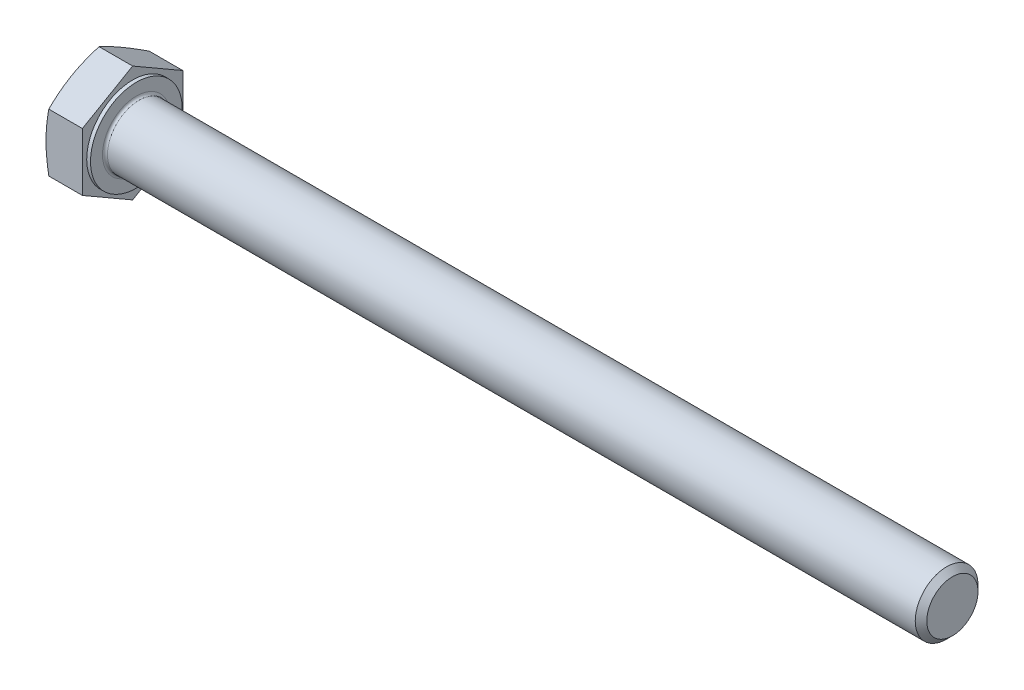
ISO-10303-21;
HEADER;
FILE_DESCRIPTION(('STEP AP214'),'2;1');
FILE_NAME('part.step','',(''),(''),'','','');
FILE_SCHEMA(('AUTOMOTIVE_DESIGN { 1 0 10303 214 1 1 1 1 }'));
ENDSEC;
DATA;
#1=APPLICATION_CONTEXT('core data for automotive mechanical design processes');
#2=APPLICATION_PROTOCOL_DEFINITION('international standard','automotive_design',2000,#1);
#3=PRODUCT_CONTEXT('',#1,'mechanical');
#4=PRODUCT('Part','Part','',(#3));
#5=PRODUCT_RELATED_PRODUCT_CATEGORY('part','',(#4));
#6=PRODUCT_DEFINITION_FORMATION('','',#4);
#7=PRODUCT_DEFINITION_CONTEXT('part definition',#1,'design');
#8=PRODUCT_DEFINITION('design','',#6,#7);
#9=PRODUCT_DEFINITION_SHAPE('','',#8);
#10=(LENGTH_UNIT() NAMED_UNIT(*) SI_UNIT(.MILLI.,.METRE.));
#11=(NAMED_UNIT(*) PLANE_ANGLE_UNIT() SI_UNIT($,.RADIAN.));
#12=(NAMED_UNIT(*) SI_UNIT($,.STERADIAN.) SOLID_ANGLE_UNIT());
#13=UNCERTAINTY_MEASURE_WITH_UNIT(LENGTH_MEASURE(1.E-05),#10,'distance_accuracy_value','');
#14=(GEOMETRIC_REPRESENTATION_CONTEXT(3) GLOBAL_UNCERTAINTY_ASSIGNED_CONTEXT((#13)) GLOBAL_UNIT_ASSIGNED_CONTEXT((#10,
#11,#12)) REPRESENTATION_CONTEXT('',''));
#15=CARTESIAN_POINT('',(0.,0.,0.));
#16=DIRECTION('',(0.,0.,1.));
#17=DIRECTION('',(1.,0.,0.));
#18=AXIS2_PLACEMENT_3D('',#15,#16,#17);
#19=CARTESIAN_POINT('',(-6.40000000000001,4.,0.));
#20=DIRECTION('',(-1.,0.,0.));
#21=DIRECTION('',(0.,-1.,0.));
#22=AXIS2_PLACEMENT_3D('',#19,#20,#21);
#23=PLANE('',#22);
#24=CARTESIAN_POINT('',(-6.4,0.,0.));
#25=DIRECTION('',(1.,0.,0.));
#26=DIRECTION('',(0.,0.,-1.));
#27=AXIS2_PLACEMENT_3D('',#24,#25,#26);
#28=CIRCLE('',#27,8.);
#29=CARTESIAN_POINT('',(-6.4,0.,8.));
#30=VERTEX_POINT('',#29);
#31=CARTESIAN_POINT('',(-6.4,-6.92820323027551,4.));
#32=VERTEX_POINT('',#31);
#33=EDGE_CURVE('E91',#30,#32,#28,.T.);
#34=ORIENTED_EDGE('',*,*,#33,.F.);
#35=CARTESIAN_POINT('',(-6.4,0.,0.));
#36=DIRECTION('',(1.,0.,0.));
#37=DIRECTION('',(0.,0.,-1.));
#38=AXIS2_PLACEMENT_3D('',#35,#36,#37);
#39=CIRCLE('',#38,8.);
#40=CARTESIAN_POINT('',(-6.4,6.92820323027551,4.));
#41=VERTEX_POINT('',#40);
#42=EDGE_CURVE('E88',#41,#30,#39,.T.);
#43=ORIENTED_EDGE('',*,*,#42,.F.);
#44=CARTESIAN_POINT('',(-6.4,0.,0.));
#45=DIRECTION('',(1.,0.,0.));
#46=DIRECTION('',(0.,0.,-1.));
#47=AXIS2_PLACEMENT_3D('',#44,#45,#46);
#48=CIRCLE('',#47,8.);
#49=CARTESIAN_POINT('',(-6.4,6.92820323027551,-4.));
#50=VERTEX_POINT('',#49);
#51=EDGE_CURVE('E20',#50,#41,#48,.T.);
#52=ORIENTED_EDGE('',*,*,#51,.F.);
#53=CARTESIAN_POINT('',(-6.4,0.,0.));
#54=DIRECTION('',(1.,0.,0.));
#55=DIRECTION('',(0.,0.,-1.));
#56=AXIS2_PLACEMENT_3D('',#53,#54,#55);
#57=CIRCLE('',#56,8.);
#58=CARTESIAN_POINT('',(-6.4,0.,-8.));
#59=VERTEX_POINT('',#58);
#60=EDGE_CURVE('E458',#59,#50,#57,.T.);
#61=ORIENTED_EDGE('',*,*,#60,.F.);
#62=CARTESIAN_POINT('',(-6.4,0.,0.));
#63=DIRECTION('',(1.,0.,0.));
#64=DIRECTION('',(0.,0.,-1.));
#65=AXIS2_PLACEMENT_3D('',#62,#63,#64);
#66=CIRCLE('',#65,8.);
#67=CARTESIAN_POINT('',(-6.4,-6.92820323027551,-4.));
#68=VERTEX_POINT('',#67);
#69=EDGE_CURVE('E144',#68,#59,#66,.T.);
#70=ORIENTED_EDGE('',*,*,#69,.F.);
#71=CARTESIAN_POINT('',(-6.4,0.,0.));
#72=DIRECTION('',(1.,0.,0.));
#73=DIRECTION('',(0.,0.,-1.));
#74=AXIS2_PLACEMENT_3D('',#71,#72,#73);
#75=CIRCLE('',#74,8.);
#76=EDGE_CURVE('E461',#32,#68,#75,.T.);
#77=ORIENTED_EDGE('',*,*,#76,.F.);
#78=EDGE_LOOP('',(#34,#43,#52,#61,#70,#77));
#79=FACE_BOUND('',#78,.T.);
#80=ADVANCED_FACE('F17',(#79),#23,.T.);
#81=CARTESIAN_POINT('',(-5.94684616366261,0.,0.));
#82=DIRECTION('',(1.,0.,0.));
#83=DIRECTION('',(0.,0.,-1.));
#84=AXIS2_PLACEMENT_3D('',#81,#82,#83);
#85=CONICAL_SURFACE('',#84,9.24502993287622,1.22173047639603);
#86=CARTESIAN_POINT('',(-5.94954887043997,9.23760430703401,0.));
#87=CARTESIAN_POINT('',(-6.0189554919584,9.04699301373568,-0.330148444489122));
#88=CARTESIAN_POINT('',(-6.08210881983726,8.85574168662193,-0.661405460065111));
#89=CARTESIAN_POINT('',(-6.19312435223035,8.4725470898503,-1.32511797085945));
#90=CARTESIAN_POINT('',(-6.2410180539724,8.2806060833912,-1.65756954610252));
#91=CARTESIAN_POINT('',(-6.29954477675596,7.99197193503742,-2.15749855585063));
#92=CARTESIAN_POINT('',(-6.31683744818615,7.89561522083007,-2.32439328050816));
#93=CARTESIAN_POINT('',(-6.34671128613204,7.70271864001328,-2.65849995908915));
#94=CARTESIAN_POINT('',(-6.35929248729026,7.60617877475577,-2.82571191067102));
#95=CARTESIAN_POINT('',(-6.37954032349552,7.41276991866169,-3.16070587605975));
#96=CARTESIAN_POINT('',(-6.38719677175787,7.31590065963306,-3.32848835438887));
#97=CARTESIAN_POINT('',(-6.3974348802494,7.12208919068794,-3.66417966569138));
#98=CARTESIAN_POINT('',(-6.40001621678527,7.02514697651278,-3.83208850604099));
#99=CARTESIAN_POINT('',(-6.40000000000001,6.92820323027551,-4.));
#100=B_SPLINE_CURVE_WITH_KNOTS('',3,(#86,#87,#88,#89,#90,#91,#92,#93,#94,#95,#96,#97,#98,#99),
.UNSPECIFIED.,.F.,.F.,(4,2,2,2,2,2,4),(0.,1.16263946409828,2.3228633521444,2.90327412454227,
3.48368062920934,4.06528386852067,4.64692420159143),.UNSPECIFIED.);
#101=CARTESIAN_POINT('',(-5.94954887043997,9.23760430703401,0.));
#102=VERTEX_POINT('',#101);
#103=EDGE_CURVE('E108',#102,#50,#100,.T.);
#104=ORIENTED_EDGE('',*,*,#103,.T.);
#105=ORIENTED_EDGE('',*,*,#51,.T.);
#106=CARTESIAN_POINT('',(-6.4,6.92820323027551,4.));
#107=CARTESIAN_POINT('',(-6.40001621678527,7.02514697651277,3.83208850604099));
#108=CARTESIAN_POINT('',(-6.3974348802494,7.12208919068794,3.66417966569139));
#109=CARTESIAN_POINT('',(-6.38719677175787,7.31590065963306,3.32848835438887));
#110=CARTESIAN_POINT('',(-6.37954032349552,7.41276991866168,3.16070587605975));
#111=CARTESIAN_POINT('',(-6.35929248729026,7.60617877475577,2.82571191067102));
#112=CARTESIAN_POINT('',(-6.34671128613205,7.70271864001328,2.65849995908915));
#113=CARTESIAN_POINT('',(-6.31683744818615,7.89561522083007,2.32439328050816));
#114=CARTESIAN_POINT('',(-6.29954477675596,7.99197193503742,2.15749855585063));
#115=CARTESIAN_POINT('',(-6.2410180539724,8.2806060833912,1.65756954610252));
#116=CARTESIAN_POINT('',(-6.19312435223035,8.4725470898503,1.32511797085945));
#117=CARTESIAN_POINT('',(-6.08210881983726,8.85574168662193,0.661405460065112));
#118=CARTESIAN_POINT('',(-6.0189554919584,9.04699301373568,0.330148444489123));
#119=CARTESIAN_POINT('',(-5.94954887043997,9.23760430703401,0.));
#120=B_SPLINE_CURVE_WITH_KNOTS('',3,(#106,#107,#108,#109,#110,#111,#112,#113,#114,#115,#116,
#117,#118,#119),.UNSPECIFIED.,.F.,.F.,(4,2,2,2,2,2,4),(0.,0.581640333070762,1.16324357238209,
1.74365007704917,2.32406084944703,3.48428473749316,4.64692420159143),.UNSPECIFIED.);
#121=EDGE_CURVE('E102',#41,#102,#120,.T.);
#122=ORIENTED_EDGE('',*,*,#121,.T.);
#123=EDGE_LOOP('',(#104,#105,#122));
#124=FACE_BOUND('',#123,.T.);
#125=ADVANCED_FACE('F106',(#124),#85,.T.);
#126=CARTESIAN_POINT('',(-5.94684616366261,0.,0.));
#127=DIRECTION('',(1.,0.,0.));
#128=DIRECTION('',(0.,0.,-1.));
#129=AXIS2_PLACEMENT_3D('',#126,#127,#128);
#130=CONICAL_SURFACE('',#129,9.24502993287622,1.22173047639603);
#131=CARTESIAN_POINT('',(-5.94954887043997,4.61880215351701,8.));
#132=CARTESIAN_POINT('',(-6.0189554919584,4.80941344681534,7.66985155551088));
#133=CARTESIAN_POINT('',(-6.08210881983726,5.00066477392909,7.33859453993489));
#134=CARTESIAN_POINT('',(-6.19312435223035,5.38385937070072,6.67488202914055));
#135=CARTESIAN_POINT('',(-6.2410180539724,5.57580037715982,6.34243045389749));
#136=CARTESIAN_POINT('',(-6.29954477675596,5.8644345255136,5.84250144414937));
#137=CARTESIAN_POINT('',(-6.31683744818615,5.96079123972095,5.67560671949185));
#138=CARTESIAN_POINT('',(-6.34671128613204,6.15368782053773,5.34150004091086));
#139=CARTESIAN_POINT('',(-6.35929248729026,6.25022768579525,5.17428808932898));
#140=CARTESIAN_POINT('',(-6.37954032349552,6.44363654188933,4.83929412394025));
#141=CARTESIAN_POINT('',(-6.38719677175787,6.54050580091795,4.67151164561113));
#142=CARTESIAN_POINT('',(-6.3974348802494,6.73431726986308,4.33582033430862));
#143=CARTESIAN_POINT('',(-6.40001621678527,6.83125948403824,4.16791149395901));
#144=CARTESIAN_POINT('',(-6.40000000000001,6.92820323027551,4.));
#145=B_SPLINE_CURVE_WITH_KNOTS('',3,(#131,#132,#133,#134,#135,#136,#137,#138,#139,#140,#141,
#142,#143,#144),.UNSPECIFIED.,.F.,.F.,(4,2,2,2,2,2,4),(0.,1.16263946409828,2.3228633521444,
2.90327412454226,3.48368062920934,4.06528386852066,4.64692420159143),.UNSPECIFIED.);
#146=CARTESIAN_POINT('',(-5.94954887043997,4.61880215351701,8.));
#147=VERTEX_POINT('',#146);
#148=EDGE_CURVE('E96',#147,#41,#145,.T.);
#149=ORIENTED_EDGE('',*,*,#148,.T.);
#150=ORIENTED_EDGE('',*,*,#42,.T.);
#151=CARTESIAN_POINT('',(-6.4,0.,8.));
#152=CARTESIAN_POINT('',(-6.40001621678527,0.193887492474531,8.));
#153=CARTESIAN_POINT('',(-6.3974348802494,0.38777192082486,8.));
#154=CARTESIAN_POINT('',(-6.38719677175787,0.77539485871511,8.));
#155=CARTESIAN_POINT('',(-6.37954032349552,0.969133376772353,8.));
#156=CARTESIAN_POINT('',(-6.35929248729026,1.35595108896052,8.));
#157=CARTESIAN_POINT('',(-6.34671128613204,1.54903081947555,8.));
#158=CARTESIAN_POINT('',(-6.31683744818615,1.93482398110913,8.));
#159=CARTESIAN_POINT('',(-6.29954477675596,2.12753740952383,8.));
#160=CARTESIAN_POINT('',(-6.2410180539724,2.70480570623138,8.));
#161=CARTESIAN_POINT('',(-6.19312435223035,3.08868771914958,8.));
#162=CARTESIAN_POINT('',(-6.08210881983726,3.85507691269285,8.));
#163=CARTESIAN_POINT('',(-6.0189554919584,4.23757956692035,8.));
#164=CARTESIAN_POINT('',(-5.94954887043997,4.61880215351701,8.));
#165=B_SPLINE_CURVE_WITH_KNOTS('',3,(#151,#152,#153,#154,#155,#156,#157,#158,#159,#160,#161,
#162,#163,#164),.UNSPECIFIED.,.F.,.F.,(4,2,2,2,2,2,4),(0.,0.581640333070763,1.16324357238209,
1.74365007704917,2.32406084944703,3.48428473749315,4.64692420159143),.UNSPECIFIED.);
#166=EDGE_CURVE('E98',#30,#147,#165,.T.);
#167=ORIENTED_EDGE('',*,*,#166,.T.);
#168=EDGE_LOOP('',(#149,#150,#167));
#169=FACE_BOUND('',#168,.T.);
#170=ADVANCED_FACE('F97',(#169),#130,.T.);
#171=CARTESIAN_POINT('',(-5.94684616366261,0.,0.));
#172=DIRECTION('',(1.,0.,0.));
#173=DIRECTION('',(0.,0.,-1.));
#174=AXIS2_PLACEMENT_3D('',#171,#172,#173);
#175=CONICAL_SURFACE('',#174,9.24502993287622,1.22173047639603);
#176=CARTESIAN_POINT('',(-5.94954887043997,-4.61880215351701,8.));
#177=CARTESIAN_POINT('',(-6.0189554919584,-4.23757956692034,8.));
#178=CARTESIAN_POINT('',(-6.08210881983726,-3.85507691269285,8.));
#179=CARTESIAN_POINT('',(-6.19312435223035,-3.08868771914958,8.));
#180=CARTESIAN_POINT('',(-6.2410180539724,-2.70480570623138,8.));
#181=CARTESIAN_POINT('',(-6.29954477675596,-2.12753740952382,8.));
#182=CARTESIAN_POINT('',(-6.31683744818615,-1.93482398110912,8.));
#183=CARTESIAN_POINT('',(-6.34671128613204,-1.54903081947555,8.));
#184=CARTESIAN_POINT('',(-6.35929248729026,-1.35595108896052,8.));
#185=CARTESIAN_POINT('',(-6.37954032349552,-0.969133376772351,8.));
#186=CARTESIAN_POINT('',(-6.38719677175787,-0.775394858715109,8.));
#187=CARTESIAN_POINT('',(-6.3974348802494,-0.387771920824859,8.));
#188=CARTESIAN_POINT('',(-6.40001621678527,-0.193887492474529,8.));
#189=CARTESIAN_POINT('',(-6.4,0.,8.));
#190=B_SPLINE_CURVE_WITH_KNOTS('',3,(#176,#177,#178,#179,#180,#181,#182,#183,#184,#185,#186,
#187,#188,#189),.UNSPECIFIED.,.F.,.F.,(4,2,2,2,2,2,4),(0.,1.16263946409828,2.3228633521444,
2.90327412454227,3.48368062920934,4.06528386852067,4.64692420159143),.UNSPECIFIED.);
#191=CARTESIAN_POINT('',(-5.94954887043997,-4.61880215351701,8.));
#192=VERTEX_POINT('',#191);
#193=EDGE_CURVE('E115',#192,#30,#190,.T.);
#194=ORIENTED_EDGE('',*,*,#193,.T.);
#195=ORIENTED_EDGE('',*,*,#33,.T.);
#196=CARTESIAN_POINT('',(-6.4,-6.92820323027551,4.));
#197=CARTESIAN_POINT('',(-6.40001621678527,-6.83125948403824,4.16791149395901));
#198=CARTESIAN_POINT('',(-6.3974348802494,-6.73431726986308,4.33582033430862));
#199=CARTESIAN_POINT('',(-6.38719677175787,-6.54050580091795,4.67151164561113));
#200=CARTESIAN_POINT('',(-6.37954032349552,-6.44363654188933,4.83929412394026));
#201=CARTESIAN_POINT('',(-6.35929248729026,-6.25022768579525,5.17428808932898));
#202=CARTESIAN_POINT('',(-6.34671128613204,-6.15368782053773,5.34150004091086));
#203=CARTESIAN_POINT('',(-6.31683744818615,-5.96079123972095,5.67560671949185));
#204=CARTESIAN_POINT('',(-6.29954477675596,-5.8644345255136,5.84250144414937));
#205=CARTESIAN_POINT('',(-6.2410180539724,-5.57580037715982,6.34243045389749));
#206=CARTESIAN_POINT('',(-6.19312435223035,-5.38385937070072,6.67488202914055));
#207=CARTESIAN_POINT('',(-6.08210881983726,-5.00066477392909,7.33859453993489));
#208=CARTESIAN_POINT('',(-6.0189554919584,-4.80941344681534,7.66985155551088));
#209=CARTESIAN_POINT('',(-5.94954887043997,-4.61880215351701,8.));
#210=B_SPLINE_CURVE_WITH_KNOTS('',3,(#196,#197,#198,#199,#200,#201,#202,#203,#204,#205,#206,
#207,#208,#209),.UNSPECIFIED.,.F.,.F.,(4,2,2,2,2,2,4),(0.,0.581640333070762,1.16324357238209,
1.74365007704916,2.32406084944703,3.48428473749315,4.64692420159143),.UNSPECIFIED.);
#211=EDGE_CURVE('E219',#32,#192,#210,.T.);
#212=ORIENTED_EDGE('',*,*,#211,.T.);
#213=EDGE_LOOP('',(#194,#195,#212));
#214=FACE_BOUND('',#213,.T.);
#215=ADVANCED_FACE('F209',(#214),#175,.T.);
#216=CARTESIAN_POINT('',(-5.94684616366261,0.,0.));
#217=DIRECTION('',(1.,0.,0.));
#218=DIRECTION('',(0.,0.,-1.));
#219=AXIS2_PLACEMENT_3D('',#216,#217,#218);
#220=CONICAL_SURFACE('',#219,9.24502993287622,1.22173047639603);
#221=ORIENTED_EDGE('',*,*,#76,.T.);
#222=CARTESIAN_POINT('',(-6.40000000000001,-6.92820323027551,-4.));
#223=CARTESIAN_POINT('',(-6.40001621678527,-7.02514697651278,-3.83208850604099));
#224=CARTESIAN_POINT('',(-6.3974348802494,-7.12208919068794,-3.66417966569138));
#225=CARTESIAN_POINT('',(-6.38719677175787,-7.31590065963307,-3.32848835438887));
#226=CARTESIAN_POINT('',(-6.37954032349552,-7.41276991866169,-3.16070587605975));
#227=CARTESIAN_POINT('',(-6.35929248729026,-7.60617877475577,-2.82571191067102));
#228=CARTESIAN_POINT('',(-6.34671128613204,-7.70271864001329,-2.65849995908914));
#229=CARTESIAN_POINT('',(-6.31683744818615,-7.89561522083007,-2.32439328050815));
#230=CARTESIAN_POINT('',(-6.29954477675596,-7.99197193503742,-2.15749855585063));
#231=CARTESIAN_POINT('',(-6.2410180539724,-8.2806060833912,-1.65756954610252));
#232=CARTESIAN_POINT('',(-6.19312435223035,-8.4725470898503,-1.32511797085945));
#233=CARTESIAN_POINT('',(-6.08210881983726,-8.85574168662193,-0.66140546006511));
#234=CARTESIAN_POINT('',(-6.0189554919584,-9.04699301373568,-0.33014844448912));
#235=CARTESIAN_POINT('',(-5.94954887043997,-9.23760430703401,0.));
#236=B_SPLINE_CURVE_WITH_KNOTS('',3,(#222,#223,#224,#225,#226,#227,#228,#229,#230,#231,#232,
#233,#234,#235),.UNSPECIFIED.,.F.,.F.,(4,2,2,2,2,2,4),(0.,0.581640333070762,1.16324357238209,
1.74365007704916,2.32406084944703,3.48428473749315,4.64692420159143),.UNSPECIFIED.);
#237=CARTESIAN_POINT('',(-5.94954887043997,-9.23760430703401,0.));
#238=VERTEX_POINT('',#237);
#239=EDGE_CURVE('E201',#68,#238,#236,.T.);
#240=ORIENTED_EDGE('',*,*,#239,.T.);
#241=CARTESIAN_POINT('',(-5.94954887043997,-9.23760430703401,0.));
#242=CARTESIAN_POINT('',(-6.0189554919584,-9.04699301373568,0.330148444489124));
#243=CARTESIAN_POINT('',(-6.08210881983726,-8.85574168662193,0.661405460065113));
#244=CARTESIAN_POINT('',(-6.19312435223035,-8.4725470898503,1.32511797085945));
#245=CARTESIAN_POINT('',(-6.2410180539724,-8.2806060833912,1.65756954610252));
#246=CARTESIAN_POINT('',(-6.29954477675596,-7.99197193503742,2.15749855585063));
#247=CARTESIAN_POINT('',(-6.31683744818615,-7.89561522083007,2.32439328050816));
#248=CARTESIAN_POINT('',(-6.34671128613204,-7.70271864001328,2.65849995908915));
#249=CARTESIAN_POINT('',(-6.35929248729026,-7.60617877475577,2.82571191067102));
#250=CARTESIAN_POINT('',(-6.37954032349552,-7.41276991866169,3.16070587605975));
#251=CARTESIAN_POINT('',(-6.38719677175787,-7.31590065963306,3.32848835438887));
#252=CARTESIAN_POINT('',(-6.3974348802494,-7.12208919068794,3.66417966569139));
#253=CARTESIAN_POINT('',(-6.40001621678527,-7.02514697651277,3.832088506041));
#254=CARTESIAN_POINT('',(-6.4,-6.92820323027551,4.));
#255=B_SPLINE_CURVE_WITH_KNOTS('',3,(#241,#242,#243,#244,#245,#246,#247,#248,#249,#250,#251,
#252,#253,#254),.UNSPECIFIED.,.F.,.F.,(4,2,2,2,2,2,4),(0.,1.16263946409828,2.3228633521444,
2.90327412454227,3.48368062920934,4.06528386852067,4.64692420159143),.UNSPECIFIED.);
#256=EDGE_CURVE('E214',#238,#32,#255,.T.);
#257=ORIENTED_EDGE('',*,*,#256,.T.);
#258=EDGE_LOOP('',(#221,#240,#257));
#259=FACE_BOUND('',#258,.T.);
#260=ADVANCED_FACE('F206',(#259),#220,.T.);
#261=CARTESIAN_POINT('',(-5.94684616366261,0.,0.));
#262=DIRECTION('',(1.,0.,0.));
#263=DIRECTION('',(0.,0.,-1.));
#264=AXIS2_PLACEMENT_3D('',#261,#262,#263);
#265=CONICAL_SURFACE('',#264,9.24502993287622,1.22173047639603);
#266=ORIENTED_EDGE('',*,*,#60,.T.);
#267=CARTESIAN_POINT('',(-6.4,6.92820323027551,-4.));
#268=CARTESIAN_POINT('',(-6.40001621678527,6.83125948403825,-4.16791149395901));
#269=CARTESIAN_POINT('',(-6.3974348802494,6.73431726986308,-4.33582033430862));
#270=CARTESIAN_POINT('',(-6.38719677175787,6.54050580091796,-4.67151164561113));
#271=CARTESIAN_POINT('',(-6.37954032349552,6.44363654188933,-4.83929412394025));
#272=CARTESIAN_POINT('',(-6.35929248729026,6.25022768579525,-5.17428808932898));
#273=CARTESIAN_POINT('',(-6.34671128613204,6.15368782053773,-5.34150004091085));
#274=CARTESIAN_POINT('',(-6.31683744818615,5.96079123972095,-5.67560671949184));
#275=CARTESIAN_POINT('',(-6.29954477675596,5.8644345255136,-5.84250144414937));
#276=CARTESIAN_POINT('',(-6.2410180539724,5.57580037715982,-6.34243045389748));
#277=CARTESIAN_POINT('',(-6.19312435223035,5.38385937070072,-6.67488202914055));
#278=CARTESIAN_POINT('',(-6.08210881983726,5.00066477392909,-7.33859453993489));
#279=CARTESIAN_POINT('',(-6.0189554919584,4.80941344681534,-7.66985155551088));
#280=CARTESIAN_POINT('',(-5.94954887043997,4.61880215351701,-8.));
#281=B_SPLINE_CURVE_WITH_KNOTS('',3,(#267,#268,#269,#270,#271,#272,#273,#274,#275,#276,#277,
#278,#279,#280),.UNSPECIFIED.,.F.,.F.,(4,2,2,2,2,2,4),(0.,0.581640333070762,1.16324357238209,
1.74365007704916,2.32406084944703,3.48428473749315,4.64692420159143),.UNSPECIFIED.);
#282=CARTESIAN_POINT('',(-5.94954887043997,4.61880215351701,-8.));
#283=VERTEX_POINT('',#282);
#284=EDGE_CURVE('E103',#50,#283,#281,.T.);
#285=ORIENTED_EDGE('',*,*,#284,.T.);
#286=CARTESIAN_POINT('',(-5.94954887043997,4.61880215351701,-8.));
#287=CARTESIAN_POINT('',(-6.0189554919584,4.23757956692035,-8.));
#288=CARTESIAN_POINT('',(-6.08210881983726,3.85507691269285,-8.));
#289=CARTESIAN_POINT('',(-6.19312435223035,3.08868771914958,-8.));
#290=CARTESIAN_POINT('',(-6.2410180539724,2.70480570623138,-8.));
#291=CARTESIAN_POINT('',(-6.29954477675596,2.12753740952382,-8.));
#292=CARTESIAN_POINT('',(-6.31683744818615,1.93482398110912,-8.));
#293=CARTESIAN_POINT('',(-6.34671128613205,1.54903081947555,-8.));
#294=CARTESIAN_POINT('',(-6.35929248729027,1.35595108896052,-8.));
#295=CARTESIAN_POINT('',(-6.37954032349552,0.969133376772351,-8.));
#296=CARTESIAN_POINT('',(-6.38719677175787,0.775394858715108,-8.));
#297=CARTESIAN_POINT('',(-6.3974348802494,0.387771920824858,-8.));
#298=CARTESIAN_POINT('',(-6.40001621678527,0.193887492474529,-8.));
#299=CARTESIAN_POINT('',(-6.40000000000001,0.,-8.));
#300=B_SPLINE_CURVE_WITH_KNOTS('',3,(#286,#287,#288,#289,#290,#291,#292,#293,#294,#295,#296,
#297,#298,#299),.UNSPECIFIED.,.F.,.F.,(4,2,2,2,2,2,4),(0.,1.16263946409828,2.3228633521444,
2.90327412454227,3.48368062920934,4.06528386852067,4.64692420159143),.UNSPECIFIED.);
#301=EDGE_CURVE('E180',#283,#59,#300,.T.);
#302=ORIENTED_EDGE('',*,*,#301,.T.);
#303=EDGE_LOOP('',(#266,#285,#302));
#304=FACE_BOUND('',#303,.T.);
#305=ADVANCED_FACE('F159',(#304),#265,.T.);
#306=CARTESIAN_POINT('',(-5.94684616366261,0.,0.));
#307=DIRECTION('',(1.,0.,0.));
#308=DIRECTION('',(0.,0.,-1.));
#309=AXIS2_PLACEMENT_3D('',#306,#307,#308);
#310=CONICAL_SURFACE('',#309,9.24502993287622,1.22173047639603);
#311=ORIENTED_EDGE('',*,*,#69,.T.);
#312=CARTESIAN_POINT('',(-6.40000000000001,0.,-8.));
#313=CARTESIAN_POINT('',(-6.40001621678527,-0.193887492474531,-8.));
#314=CARTESIAN_POINT('',(-6.3974348802494,-0.387771920824861,-8.));
#315=CARTESIAN_POINT('',(-6.38719677175787,-0.775394858715111,-8.));
#316=CARTESIAN_POINT('',(-6.37954032349552,-0.969133376772353,-8.));
#317=CARTESIAN_POINT('',(-6.35929248729027,-1.35595108896052,-8.));
#318=CARTESIAN_POINT('',(-6.34671128613205,-1.54903081947555,-8.));
#319=CARTESIAN_POINT('',(-6.31683744818615,-1.93482398110913,-8.));
#320=CARTESIAN_POINT('',(-6.29954477675596,-2.12753740952383,-8.));
#321=CARTESIAN_POINT('',(-6.2410180539724,-2.70480570623138,-8.));
#322=CARTESIAN_POINT('',(-6.19312435223035,-3.08868771914958,-8.));
#323=CARTESIAN_POINT('',(-6.08210881983726,-3.85507691269285,-8.));
#324=CARTESIAN_POINT('',(-6.0189554919584,-4.23757956692035,-8.));
#325=CARTESIAN_POINT('',(-5.94954887043997,-4.61880215351701,-8.));
#326=B_SPLINE_CURVE_WITH_KNOTS('',3,(#312,#313,#314,#315,#316,#317,#318,#319,#320,#321,#322,
#323,#324,#325),.UNSPECIFIED.,.F.,.F.,(4,2,2,2,2,2,4),(0.,0.581640333070763,1.16324357238209,
1.74365007704917,2.32406084944703,3.48428473749315,4.64692420159143),.UNSPECIFIED.);
#327=CARTESIAN_POINT('',(-5.94954887043997,-4.61880215351701,-8.));
#328=VERTEX_POINT('',#327);
#329=EDGE_CURVE('E173',#59,#328,#326,.T.);
#330=ORIENTED_EDGE('',*,*,#329,.T.);
#331=CARTESIAN_POINT('',(-5.94954887043997,-4.61880215351701,-8.));
#332=CARTESIAN_POINT('',(-6.0189554919584,-4.80941344681534,-7.66985155551088));
#333=CARTESIAN_POINT('',(-6.08210881983726,-5.00066477392909,-7.33859453993489));
#334=CARTESIAN_POINT('',(-6.19312435223035,-5.38385937070072,-6.67488202914055));
#335=CARTESIAN_POINT('',(-6.2410180539724,-5.57580037715982,-6.34243045389748));
#336=CARTESIAN_POINT('',(-6.29954477675596,-5.8644345255136,-5.84250144414937));
#337=CARTESIAN_POINT('',(-6.31683744818615,-5.96079123972095,-5.67560671949184));
#338=CARTESIAN_POINT('',(-6.34671128613205,-6.15368782053773,-5.34150004091085));
#339=CARTESIAN_POINT('',(-6.35929248729027,-6.25022768579525,-5.17428808932898));
#340=CARTESIAN_POINT('',(-6.37954032349552,-6.44363654188934,-4.83929412394025));
#341=CARTESIAN_POINT('',(-6.38719677175787,-6.54050580091796,-4.67151164561113));
#342=CARTESIAN_POINT('',(-6.3974348802494,-6.73431726986308,-4.33582033430861));
#343=CARTESIAN_POINT('',(-6.40001621678527,-6.83125948403825,-4.167911493959));
#344=CARTESIAN_POINT('',(-6.40000000000001,-6.92820323027551,-4.));
#345=B_SPLINE_CURVE_WITH_KNOTS('',3,(#331,#332,#333,#334,#335,#336,#337,#338,#339,#340,#341,
#342,#343,#344),.UNSPECIFIED.,.F.,.F.,(4,2,2,2,2,2,4),(0.,1.16263946409828,2.3228633521444,
2.90327412454227,3.48368062920934,4.06528386852067,4.64692420159143),.UNSPECIFIED.);
#346=EDGE_CURVE('E165',#328,#68,#345,.T.);
#347=ORIENTED_EDGE('',*,*,#346,.T.);
#348=EDGE_LOOP('',(#311,#330,#347));
#349=FACE_BOUND('',#348,.T.);
#350=ADVANCED_FACE('F154',(#349),#310,.T.);
#351=CARTESIAN_POINT('',(0.,9.23760430703401,0.));
#352=DIRECTION('',(0.,-0.866025403784439,0.5));
#353=DIRECTION('',(0.,-0.5,-0.866025403784439));
#354=AXIS2_PLACEMENT_3D('',#351,#352,#353);
#355=PLANE('',#354);
#356=DIRECTION('',(1.,0.,0.));
#357=VECTOR('',#356,1.);
#358=CARTESIAN_POINT('',(0.,4.61880215351701,-8.));
#359=LINE('',#358,#357);
#360=CARTESIAN_POINT('',(-0.6,4.61880215351701,-8.));
#361=VERTEX_POINT('',#360);
#362=EDGE_CURVE('E338',#361,#283,#359,.F.);
#363=ORIENTED_EDGE('',*,*,#362,.T.);
#364=ORIENTED_EDGE('',*,*,#284,.F.);
#365=ORIENTED_EDGE('',*,*,#103,.F.);
#366=DIRECTION('',(1.,0.,0.));
#367=VECTOR('',#366,1.);
#368=CARTESIAN_POINT('',(0.,9.23760430703401,0.));
#369=LINE('',#368,#367);
#370=CARTESIAN_POINT('',(-0.6,9.23760430703401,0.));
#371=VERTEX_POINT('',#370);
#372=EDGE_CURVE('E113',#102,#371,#369,.T.);
#373=ORIENTED_EDGE('',*,*,#372,.T.);
#374=DIRECTION('',(0.,0.5,0.866025403784439));
#375=VECTOR('',#374,1.);
#376=CARTESIAN_POINT('',(-0.6,4.61880215351701,-8.));
#377=LINE('',#376,#375);
#378=EDGE_CURVE('E303',#361,#371,#377,.T.);
#379=ORIENTED_EDGE('',*,*,#378,.F.);
#380=EDGE_LOOP('',(#363,#364,#365,#373,#379));
#381=FACE_BOUND('',#380,.T.);
#382=ADVANCED_FACE('F150',(#381),#355,.F.);
#383=CARTESIAN_POINT('',(0.,4.61880215351701,8.));
#384=DIRECTION('',(0.,-0.866025403784439,-0.5));
#385=DIRECTION('',(0.,0.5,-0.866025403784439));
#386=AXIS2_PLACEMENT_3D('',#383,#384,#385);
#387=PLANE('',#386);
#388=ORIENTED_EDGE('',*,*,#372,.F.);
#389=ORIENTED_EDGE('',*,*,#121,.F.);
#390=ORIENTED_EDGE('',*,*,#148,.F.);
#391=DIRECTION('',(-1.,0.,0.));
#392=VECTOR('',#391,1.);
#393=CARTESIAN_POINT('',(0.,4.61880215351701,8.));
#394=LINE('',#393,#392);
#395=CARTESIAN_POINT('',(-0.6,4.61880215351701,8.));
#396=VERTEX_POINT('',#395);
#397=EDGE_CURVE('E220',#147,#396,#394,.F.);
#398=ORIENTED_EDGE('',*,*,#397,.T.);
#399=DIRECTION('',(0.,-0.5,0.866025403784439));
#400=VECTOR('',#399,1.);
#401=CARTESIAN_POINT('',(-0.6,9.23760430703401,0.));
#402=LINE('',#401,#400);
#403=EDGE_CURVE('E299',#371,#396,#402,.T.);
#404=ORIENTED_EDGE('',*,*,#403,.F.);
#405=EDGE_LOOP('',(#388,#389,#390,#398,#404));
#406=FACE_BOUND('',#405,.T.);
#407=ADVANCED_FACE('F111',(#406),#387,.F.);
#408=CARTESIAN_POINT('',(0.,-4.61880215351701,8.));
#409=DIRECTION('',(0.,0.,-1.));
#410=DIRECTION('',(-1.,0.,0.));
#411=AXIS2_PLACEMENT_3D('',#408,#409,#410);
#412=PLANE('',#411);
#413=ORIENTED_EDGE('',*,*,#397,.F.);
#414=ORIENTED_EDGE('',*,*,#166,.F.);
#415=ORIENTED_EDGE('',*,*,#193,.F.);
#416=DIRECTION('',(1.,0.,0.));
#417=VECTOR('',#416,1.);
#418=CARTESIAN_POINT('',(0.,-4.61880215351701,8.));
#419=LINE('',#418,#417);
#420=CARTESIAN_POINT('',(-0.6,-4.61880215351701,8.));
#421=VERTEX_POINT('',#420);
#422=EDGE_CURVE('E333',#192,#421,#419,.T.);
#423=ORIENTED_EDGE('',*,*,#422,.T.);
#424=DIRECTION('',(0.,1.,0.));
#425=VECTOR('',#424,1.);
#426=CARTESIAN_POINT('',(-0.6,10.0575,8.));
#427=LINE('',#426,#425);
#428=EDGE_CURVE('E302',#396,#421,#427,.F.);
#429=ORIENTED_EDGE('',*,*,#428,.F.);
#430=EDGE_LOOP('',(#413,#414,#415,#423,#429));
#431=FACE_BOUND('',#430,.T.);
#432=ADVANCED_FACE('F227',(#431),#412,.F.);
#433=CARTESIAN_POINT('',(0.,-9.23760430703401,0.));
#434=DIRECTION('',(0.,0.866025403784439,-0.5));
#435=DIRECTION('',(0.,0.5,0.866025403784439));
#436=AXIS2_PLACEMENT_3D('',#433,#434,#435);
#437=PLANE('',#436);
#438=ORIENTED_EDGE('',*,*,#422,.F.);
#439=ORIENTED_EDGE('',*,*,#211,.F.);
#440=ORIENTED_EDGE('',*,*,#256,.F.);
#441=DIRECTION('',(1.,0.,0.));
#442=VECTOR('',#441,1.);
#443=CARTESIAN_POINT('',(0.,-9.23760430703401,0.));
#444=LINE('',#443,#442);
#445=CARTESIAN_POINT('',(-0.599999999999999,-9.23760430703401,0.));
#446=VERTEX_POINT('',#445);
#447=EDGE_CURVE('E205',#238,#446,#444,.T.);
#448=ORIENTED_EDGE('',*,*,#447,.T.);
#449=DIRECTION('',(0.,-0.5,-0.866025403784439));
#450=VECTOR('',#449,1.);
#451=CARTESIAN_POINT('',(-0.6,-4.61880215351701,8.));
#452=LINE('',#451,#450);
#453=EDGE_CURVE('E308',#421,#446,#452,.T.);
#454=ORIENTED_EDGE('',*,*,#453,.F.);
#455=EDGE_LOOP('',(#438,#439,#440,#448,#454));
#456=FACE_BOUND('',#455,.T.);
#457=ADVANCED_FACE('F198',(#456),#437,.F.);
#458=CARTESIAN_POINT('',(0.,-4.61880215351701,-8.));
#459=DIRECTION('',(0.,0.866025403784439,0.5));
#460=DIRECTION('',(0.,-0.5,0.866025403784439));
#461=AXIS2_PLACEMENT_3D('',#458,#459,#460);
#462=PLANE('',#461);
#463=ORIENTED_EDGE('',*,*,#447,.F.);
#464=ORIENTED_EDGE('',*,*,#239,.F.);
#465=ORIENTED_EDGE('',*,*,#346,.F.);
#466=DIRECTION('',(1.,0.,0.));
#467=VECTOR('',#466,1.);
#468=CARTESIAN_POINT('',(0.,-4.61880215351701,-8.));
#469=LINE('',#468,#467);
#470=CARTESIAN_POINT('',(-0.599999999999999,-4.61880215351701,-8.));
#471=VERTEX_POINT('',#470);
#472=EDGE_CURVE('E35',#328,#471,#469,.T.);
#473=ORIENTED_EDGE('',*,*,#472,.T.);
#474=DIRECTION('',(0.,0.5,-0.866025403784439));
#475=VECTOR('',#474,1.);
#476=CARTESIAN_POINT('',(-0.6,-9.23760430703402,0.));
#477=LINE('',#476,#475);
#478=EDGE_CURVE('E313',#446,#471,#477,.T.);
#479=ORIENTED_EDGE('',*,*,#478,.F.);
#480=EDGE_LOOP('',(#463,#464,#465,#473,#479));
#481=FACE_BOUND('',#480,.T.);
#482=ADVANCED_FACE('F191',(#481),#462,.F.);
#483=CARTESIAN_POINT('',(0.,4.61880215351701,-8.));
#484=DIRECTION('',(0.,0.,1.));
#485=DIRECTION('',(1.,0.,0.));
#486=AXIS2_PLACEMENT_3D('',#483,#484,#485);
#487=PLANE('',#486);
#488=ORIENTED_EDGE('',*,*,#472,.F.);
#489=ORIENTED_EDGE('',*,*,#329,.F.);
#490=ORIENTED_EDGE('',*,*,#301,.F.);
#491=ORIENTED_EDGE('',*,*,#362,.F.);
#492=DIRECTION('',(0.,1.,0.));
#493=VECTOR('',#492,1.);
#494=CARTESIAN_POINT('',(-0.6,10.0575,-8.));
#495=LINE('',#494,#493);
#496=EDGE_CURVE('E295',#471,#361,#495,.T.);
#497=ORIENTED_EDGE('',*,*,#496,.F.);
#498=EDGE_LOOP('',(#488,#489,#490,#491,#497));
#499=FACE_BOUND('',#498,.T.);
#500=ADVANCED_FACE('F186',(#499),#487,.F.);
#501=CARTESIAN_POINT('',(-0.6,10.0575,0.));
#502=DIRECTION('',(1.,0.,0.));
#503=DIRECTION('',(0.,0.,-1.));
#504=AXIS2_PLACEMENT_3D('',#501,#502,#503);
#505=PLANE('',#504);
#506=CARTESIAN_POINT('',(-0.6,0.,0.));
#507=DIRECTION('',(-1.,0.,0.));
#508=DIRECTION('',(0.,0.,1.));
#509=AXIS2_PLACEMENT_3D('',#506,#507,#508);
#510=CIRCLE('',#509,7.315);
#511=CARTESIAN_POINT('',(-0.6,0.,7.315));
#512=VERTEX_POINT('',#511);
#513=EDGE_CURVE('E181',#512,#512,#510,.F.);
#514=ORIENTED_EDGE('',*,*,#513,.F.);
#515=EDGE_LOOP('',(#514));
#516=FACE_BOUND('',#515,.T.);
#517=ORIENTED_EDGE('',*,*,#478,.T.);
#518=ORIENTED_EDGE('',*,*,#496,.T.);
#519=ORIENTED_EDGE('',*,*,#378,.T.);
#520=ORIENTED_EDGE('',*,*,#403,.T.);
#521=ORIENTED_EDGE('',*,*,#428,.T.);
#522=ORIENTED_EDGE('',*,*,#453,.T.);
#523=EDGE_LOOP('',(#517,#518,#519,#520,#521,#522));
#524=FACE_BOUND('',#523,.T.);
#525=ADVANCED_FACE('F190',(#516,#524),#505,.T.);
#526=CARTESIAN_POINT('',(-0.3,0.,0.));
#527=DIRECTION('',(-1.,0.,0.));
#528=DIRECTION('',(0.,0.,1.));
#529=AXIS2_PLACEMENT_3D('',#526,#527,#528);
#530=CYLINDRICAL_SURFACE('',#529,7.315);
#531=ORIENTED_EDGE('',*,*,#513,.T.);
#532=EDGE_LOOP('',(#531));
#533=FACE_BOUND('',#532,.T.);
#534=CARTESIAN_POINT('',(0.,0.,0.));
#535=DIRECTION('',(-1.,0.,0.));
#536=DIRECTION('',(0.,0.,1.));
#537=AXIS2_PLACEMENT_3D('',#534,#535,#536);
#538=CIRCLE('',#537,7.315);
#539=CARTESIAN_POINT('',(0.,0.,7.315));
#540=VERTEX_POINT('',#539);
#541=EDGE_CURVE('E290',#540,#540,#538,.F.);
#542=ORIENTED_EDGE('',*,*,#541,.F.);
#543=EDGE_LOOP('',(#542));
#544=FACE_BOUND('',#543,.T.);
#545=ADVANCED_FACE('F277',(#533,#544),#530,.T.);
#546=CARTESIAN_POINT('',(130.,2.04,0.));
#547=DIRECTION('',(1.,0.,0.));
#548=DIRECTION('',(0.,0.,-1.));
#549=AXIS2_PLACEMENT_3D('',#546,#547,#548);
#550=PLANE('',#549);
#551=CARTESIAN_POINT('',(130.000000000052,0.,0.));
#552=DIRECTION('',(-1.,0.,0.));
#553=DIRECTION('',(0.,0.,1.));
#554=AXIS2_PLACEMENT_3D('',#551,#552,#553);
#555=CIRCLE('',#554,4.08000000010134);
#556=CARTESIAN_POINT('',(130.000000000052,0.,4.08000000010134));
#557=VERTEX_POINT('',#556);
#558=EDGE_CURVE('E292',#557,#557,#555,.T.);
#559=ORIENTED_EDGE('',*,*,#558,.F.);
#560=EDGE_LOOP('',(#559));
#561=FACE_BOUND('',#560,.T.);
#562=ADVANCED_FACE('F275',(#561),#550,.T.);
#563=CARTESIAN_POINT('',(0.,6.3575,0.));
#564=DIRECTION('',(1.,0.,0.));
#565=DIRECTION('',(0.,0.,-1.));
#566=AXIS2_PLACEMENT_3D('',#563,#564,#565);
#567=PLANE('',#566);
#568=CARTESIAN_POINT('',(0.,0.,0.));
#569=DIRECTION('',(1.,0.,0.));
#570=DIRECTION('',(0.,1.,0.));
#571=AXIS2_PLACEMENT_3D('',#568,#569,#570);
#572=CIRCLE('',#571,5.4);
#573=CARTESIAN_POINT('',(0.,5.4,0.));
#574=VERTEX_POINT('',#573);
#575=EDGE_CURVE('E262',#574,#574,#572,.T.);
#576=ORIENTED_EDGE('',*,*,#575,.F.);
#577=EDGE_LOOP('',(#576));
#578=FACE_BOUND('',#577,.T.);
#579=ORIENTED_EDGE('',*,*,#541,.T.);
#580=EDGE_LOOP('',(#579));
#581=FACE_BOUND('',#580,.T.);
#582=ADVANCED_FACE('F266',(#578,#581),#567,.T.);
#583=CARTESIAN_POINT('',(129.080000000044,0.,0.));
#584=DIRECTION('',(-1.,0.,0.));
#585=DIRECTION('',(0.,0.,1.));
#586=AXIS2_PLACEMENT_3D('',#583,#584,#585);
#587=CONICAL_SURFACE('',#586,5.00000000010914,0.785398163397448);
#588=ORIENTED_EDGE('',*,*,#558,.T.);
#589=EDGE_LOOP('',(#588));
#590=FACE_BOUND('',#589,.T.);
#591=CARTESIAN_POINT('',(129.08,0.,0.));
#592=DIRECTION('',(-1.,0.,0.));
#593=DIRECTION('',(0.,0.,1.));
#594=AXIS2_PLACEMENT_3D('',#591,#592,#593);
#595=CIRCLE('',#594,5.);
#596=CARTESIAN_POINT('',(129.08,0.,5.));
#597=VERTEX_POINT('',#596);
#598=EDGE_CURVE('E26',#597,#597,#595,.T.);
#599=ORIENTED_EDGE('',*,*,#598,.F.);
#600=EDGE_LOOP('',(#599));
#601=FACE_BOUND('',#600,.T.);
#602=ADVANCED_FACE('F246',(#590,#601),#587,.T.);
#603=CARTESIAN_POINT('',(0.4,0.,0.));
#604=DIRECTION('',(-1.,0.,0.));
#605=DIRECTION('',(0.,0.,1.));
#606=AXIS2_PLACEMENT_3D('',#603,#604,#605);
#607=TOROIDAL_SURFACE('',#606,5.4,0.4);
#608=CARTESIAN_POINT('',(0.400000000000011,0.,0.));
#609=DIRECTION('',(-1.,0.,0.));
#610=DIRECTION('',(0.,0.,1.));
#611=AXIS2_PLACEMENT_3D('',#608,#609,#610);
#612=CIRCLE('',#611,5.);
#613=CARTESIAN_POINT('',(0.400000000000011,0.,5.));
#614=VERTEX_POINT('',#613);
#615=EDGE_CURVE('E11',#614,#614,#612,.F.);
#616=ORIENTED_EDGE('',*,*,#615,.F.);
#617=EDGE_LOOP('',(#616));
#618=FACE_BOUND('',#617,.T.);
#619=ORIENTED_EDGE('',*,*,#575,.T.);
#620=EDGE_LOOP('',(#619));
#621=FACE_BOUND('',#620,.T.);
#622=ADVANCED_FACE('F240',(#618,#621),#607,.F.);
#623=CARTESIAN_POINT('',(64.74,0.,0.));
#624=DIRECTION('',(-1.,0.,0.));
#625=DIRECTION('',(0.,0.,1.));
#626=AXIS2_PLACEMENT_3D('',#623,#624,#625);
#627=CYLINDRICAL_SURFACE('',#626,5.);
#628=ORIENTED_EDGE('',*,*,#598,.T.);
#629=EDGE_LOOP('',(#628));
#630=FACE_BOUND('',#629,.T.);
#631=ORIENTED_EDGE('',*,*,#615,.T.);
#632=EDGE_LOOP('',(#631));
#633=FACE_BOUND('',#632,.T.);
#634=ADVANCED_FACE('F238',(#630,#633),#627,.T.);
#635=CLOSED_SHELL('',(#80,#125,#170,#215,#260,#305,#350,#382,#407,#432,#457,#482,#500,#525,#545,
#562,#582,#602,#622,#634));
#636=MANIFOLD_SOLID_BREP('B1',#635);
#637=ADVANCED_BREP_SHAPE_REPRESENTATION('',(#18,#636),#14);
#638=SHAPE_DEFINITION_REPRESENTATION(#9,#637);
ENDSEC;
END-ISO-10303-21;
